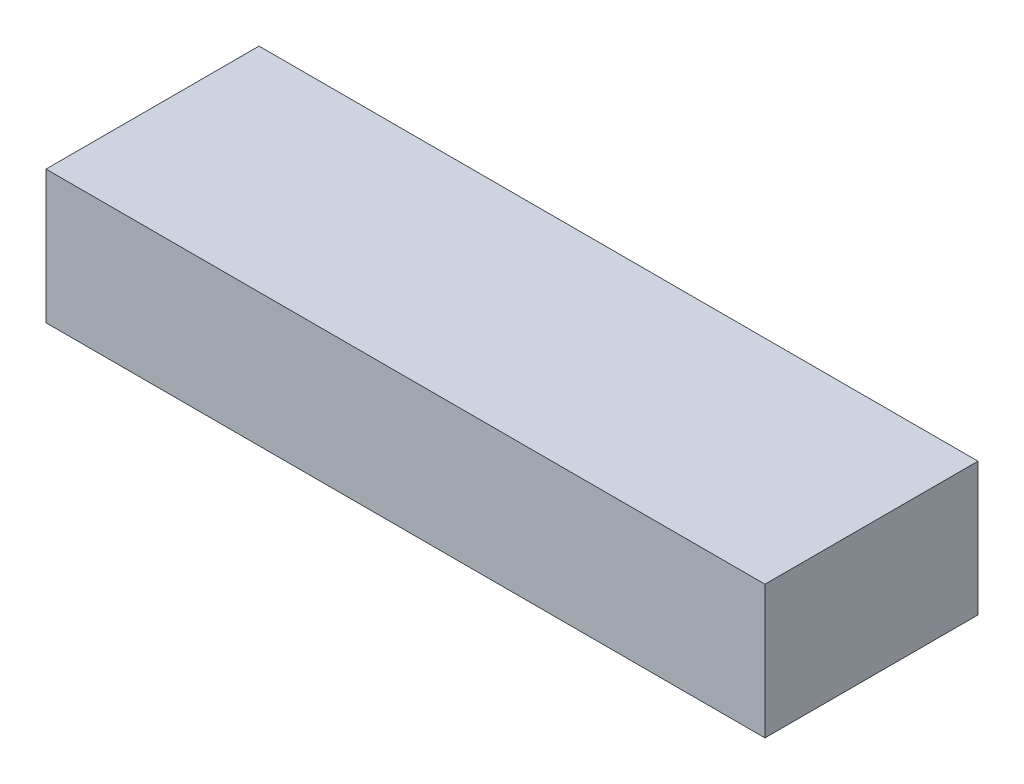
ISO-10303-21;
HEADER;
FILE_DESCRIPTION(('STEP AP214'),'2;1');
FILE_NAME('part.step','',(''),(''),'','','');
FILE_SCHEMA(('AUTOMOTIVE_DESIGN { 1 0 10303 214 1 1 1 1 }'));
ENDSEC;
DATA;
#1=APPLICATION_CONTEXT('core data for automotive mechanical design processes');
#2=APPLICATION_PROTOCOL_DEFINITION('international standard','automotive_design',2000,#1);
#3=PRODUCT_CONTEXT('',#1,'mechanical');
#4=PRODUCT('Part','Part','',(#3));
#5=PRODUCT_RELATED_PRODUCT_CATEGORY('part','',(#4));
#6=PRODUCT_DEFINITION_FORMATION('','',#4);
#7=PRODUCT_DEFINITION_CONTEXT('part definition',#1,'design');
#8=PRODUCT_DEFINITION('design','',#6,#7);
#9=PRODUCT_DEFINITION_SHAPE('','',#8);
#10=(LENGTH_UNIT() NAMED_UNIT(*) SI_UNIT(.MILLI.,.METRE.));
#11=(NAMED_UNIT(*) PLANE_ANGLE_UNIT() SI_UNIT($,.RADIAN.));
#12=(NAMED_UNIT(*) SI_UNIT($,.STERADIAN.) SOLID_ANGLE_UNIT());
#13=UNCERTAINTY_MEASURE_WITH_UNIT(LENGTH_MEASURE(1.E-05),#10,'distance_accuracy_value','');
#14=(GEOMETRIC_REPRESENTATION_CONTEXT(3) GLOBAL_UNCERTAINTY_ASSIGNED_CONTEXT((#13)) GLOBAL_UNIT_ASSIGNED_CONTEXT((#10,
#11,#12)) REPRESENTATION_CONTEXT('',''));
#15=CARTESIAN_POINT('',(0.,0.,0.));
#16=DIRECTION('',(0.,0.,1.));
#17=DIRECTION('',(1.,0.,0.));
#18=AXIS2_PLACEMENT_3D('',#15,#16,#17);
#19=CARTESIAN_POINT('',(-47.8481012658227,25.,-37.9367088607595));
#20=DIRECTION('',(1.,0.,0.));
#21=DIRECTION('',(0.,0.,-1.));
#22=AXIS2_PLACEMENT_3D('',#19,#20,#21);
#23=PLANE('',#22);
#24=DIRECTION('',(0.,0.,1.));
#25=VECTOR('',#24,1.);
#26=CARTESIAN_POINT('',(-47.8481012658227,0.,-37.9367088607595));
#27=LINE('',#26,#25);
#28=CARTESIAN_POINT('',(-47.8481012658227,0.,-37.9367088607595));
#29=VERTEX_POINT('',#28);
#30=CARTESIAN_POINT('',(-47.8481012658227,0.,2.06329113924054));
#31=VERTEX_POINT('',#30);
#32=EDGE_CURVE('E107',#29,#31,#27,.T.);
#33=ORIENTED_EDGE('',*,*,#32,.T.);
#34=DIRECTION('',(0.,-1.,0.));
#35=VECTOR('',#34,1.);
#36=CARTESIAN_POINT('',(-47.8481012658227,25.,2.06329113924054));
#37=LINE('',#36,#35);
#38=CARTESIAN_POINT('',(-47.8481012658227,25.,2.06329113924054));
#39=VERTEX_POINT('',#38);
#40=EDGE_CURVE('E11',#39,#31,#37,.T.);
#41=ORIENTED_EDGE('',*,*,#40,.F.);
#42=DIRECTION('',(0.,0.,1.));
#43=VECTOR('',#42,1.);
#44=CARTESIAN_POINT('',(-47.8481012658227,25.,-37.9367088607595));
#45=LINE('',#44,#43);
#46=CARTESIAN_POINT('',(-47.8481012658227,25.,-37.9367088607595));
#47=VERTEX_POINT('',#46);
#48=EDGE_CURVE('E91',#47,#39,#45,.T.);
#49=ORIENTED_EDGE('',*,*,#48,.F.);
#50=DIRECTION('',(0.,-1.,0.));
#51=VECTOR('',#50,1.);
#52=CARTESIAN_POINT('',(-47.8481012658227,25.,-37.9367088607595));
#53=LINE('',#52,#51);
#54=EDGE_CURVE('E103',#47,#29,#53,.T.);
#55=ORIENTED_EDGE('',*,*,#54,.T.);
#56=EDGE_LOOP('',(#33,#41,#49,#55));
#57=FACE_BOUND('',#56,.T.);
#58=ADVANCED_FACE('F39',(#57),#23,.F.);
#59=CARTESIAN_POINT('',(-47.8481012658227,25.,2.06329113924054));
#60=DIRECTION('',(0.,0.,-1.));
#61=DIRECTION('',(-1.,0.,0.));
#62=AXIS2_PLACEMENT_3D('',#59,#60,#61);
#63=PLANE('',#62);
#64=DIRECTION('',(1.,0.,0.));
#65=VECTOR('',#64,1.);
#66=CARTESIAN_POINT('',(-47.8481012658227,0.,2.06329113924054));
#67=LINE('',#66,#65);
#68=CARTESIAN_POINT('',(87.1518987341773,0.,2.06329113924054));
#69=VERTEX_POINT('',#68);
#70=EDGE_CURVE('E96',#31,#69,#67,.T.);
#71=ORIENTED_EDGE('',*,*,#70,.T.);
#72=DIRECTION('',(0.,-1.,0.));
#73=VECTOR('',#72,1.);
#74=CARTESIAN_POINT('',(87.1518987341773,25.,2.06329113924054));
#75=LINE('',#74,#73);
#76=CARTESIAN_POINT('',(87.1518987341773,25.,2.06329113924054));
#77=VERTEX_POINT('',#76);
#78=EDGE_CURVE('E48',#77,#69,#75,.T.);
#79=ORIENTED_EDGE('',*,*,#78,.F.);
#80=DIRECTION('',(1.,0.,0.));
#81=VECTOR('',#80,1.);
#82=CARTESIAN_POINT('',(-47.8481012658227,25.,2.06329113924054));
#83=LINE('',#82,#81);
#84=EDGE_CURVE('E86',#39,#77,#83,.T.);
#85=ORIENTED_EDGE('',*,*,#84,.F.);
#86=ORIENTED_EDGE('',*,*,#40,.T.);
#87=EDGE_LOOP('',(#71,#79,#85,#86));
#88=FACE_BOUND('',#87,.T.);
#89=ADVANCED_FACE('F95',(#88),#63,.F.);
#90=CARTESIAN_POINT('',(87.1518987341773,25.,-37.9367088607595));
#91=DIRECTION('',(-1.,0.,0.));
#92=DIRECTION('',(0.,0.,1.));
#93=AXIS2_PLACEMENT_3D('',#90,#91,#92);
#94=PLANE('',#93);
#95=DIRECTION('',(0.,0.,-1.));
#96=VECTOR('',#95,1.);
#97=CARTESIAN_POINT('',(87.1518987341773,0.,-37.9367088607595));
#98=LINE('',#97,#96);
#99=CARTESIAN_POINT('',(87.1518987341773,0.,-37.9367088607595));
#100=VERTEX_POINT('',#99);
#101=EDGE_CURVE('E73',#69,#100,#98,.T.);
#102=ORIENTED_EDGE('',*,*,#101,.T.);
#103=DIRECTION('',(0.,-1.,0.));
#104=VECTOR('',#103,1.);
#105=CARTESIAN_POINT('',(87.1518987341773,25.,-37.9367088607595));
#106=LINE('',#105,#104);
#107=CARTESIAN_POINT('',(87.1518987341773,25.,-37.9367088607595));
#108=VERTEX_POINT('',#107);
#109=EDGE_CURVE('E98',#108,#100,#106,.T.);
#110=ORIENTED_EDGE('',*,*,#109,.F.);
#111=DIRECTION('',(0.,0.,-1.));
#112=VECTOR('',#111,1.);
#113=CARTESIAN_POINT('',(87.1518987341773,25.,-37.9367088607595));
#114=LINE('',#113,#112);
#115=EDGE_CURVE('E89',#77,#108,#114,.T.);
#116=ORIENTED_EDGE('',*,*,#115,.F.);
#117=ORIENTED_EDGE('',*,*,#78,.T.);
#118=EDGE_LOOP('',(#102,#110,#116,#117));
#119=FACE_BOUND('',#118,.T.);
#120=ADVANCED_FACE('F99',(#119),#94,.F.);
#121=CARTESIAN_POINT('',(-47.8481012658227,25.,-37.9367088607595));
#122=DIRECTION('',(0.,0.,1.));
#123=DIRECTION('',(1.,0.,0.));
#124=AXIS2_PLACEMENT_3D('',#121,#122,#123);
#125=PLANE('',#124);
#126=DIRECTION('',(-1.,0.,0.));
#127=VECTOR('',#126,1.);
#128=CARTESIAN_POINT('',(-47.8481012658227,0.,-37.9367088607595));
#129=LINE('',#128,#127);
#130=EDGE_CURVE('E79',#100,#29,#129,.T.);
#131=ORIENTED_EDGE('',*,*,#130,.T.);
#132=ORIENTED_EDGE('',*,*,#54,.F.);
#133=DIRECTION('',(-1.,0.,0.));
#134=VECTOR('',#133,1.);
#135=CARTESIAN_POINT('',(-47.8481012658227,25.,-37.9367088607595));
#136=LINE('',#135,#134);
#137=EDGE_CURVE('E56',#108,#47,#136,.T.);
#138=ORIENTED_EDGE('',*,*,#137,.F.);
#139=ORIENTED_EDGE('',*,*,#109,.T.);
#140=EDGE_LOOP('',(#131,#132,#138,#139));
#141=FACE_BOUND('',#140,.T.);
#142=ADVANCED_FACE('F120',(#141),#125,.F.);
#143=CARTESIAN_POINT('',(0.,25.,0.));
#144=DIRECTION('',(0.,1.,0.));
#145=DIRECTION('',(0.,0.,1.));
#146=AXIS2_PLACEMENT_3D('',#143,#144,#145);
#147=PLANE('',#146);
#148=ORIENTED_EDGE('',*,*,#48,.T.);
#149=ORIENTED_EDGE('',*,*,#84,.T.);
#150=ORIENTED_EDGE('',*,*,#115,.T.);
#151=ORIENTED_EDGE('',*,*,#137,.T.);
#152=EDGE_LOOP('',(#148,#149,#150,#151));
#153=FACE_BOUND('',#152,.T.);
#154=ADVANCED_FACE('F87',(#153),#147,.T.);
#155=CARTESIAN_POINT('',(0.,0.,0.));
#156=DIRECTION('',(0.,1.,0.));
#157=DIRECTION('',(0.,0.,1.));
#158=AXIS2_PLACEMENT_3D('',#155,#156,#157);
#159=PLANE('',#158);
#160=ORIENTED_EDGE('',*,*,#32,.F.);
#161=ORIENTED_EDGE('',*,*,#130,.F.);
#162=ORIENTED_EDGE('',*,*,#101,.F.);
#163=ORIENTED_EDGE('',*,*,#70,.F.);
#164=EDGE_LOOP('',(#160,#161,#162,#163));
#165=FACE_BOUND('',#164,.T.);
#166=ADVANCED_FACE('F123',(#165),#159,.F.);
#167=CLOSED_SHELL('',(#58,#89,#120,#142,#154,#166));
#168=MANIFOLD_SOLID_BREP('B2',#167);
#169=ADVANCED_BREP_SHAPE_REPRESENTATION('',(#18,#168),#14);
#170=SHAPE_DEFINITION_REPRESENTATION(#9,#169);
ENDSEC;
END-ISO-10303-21;
